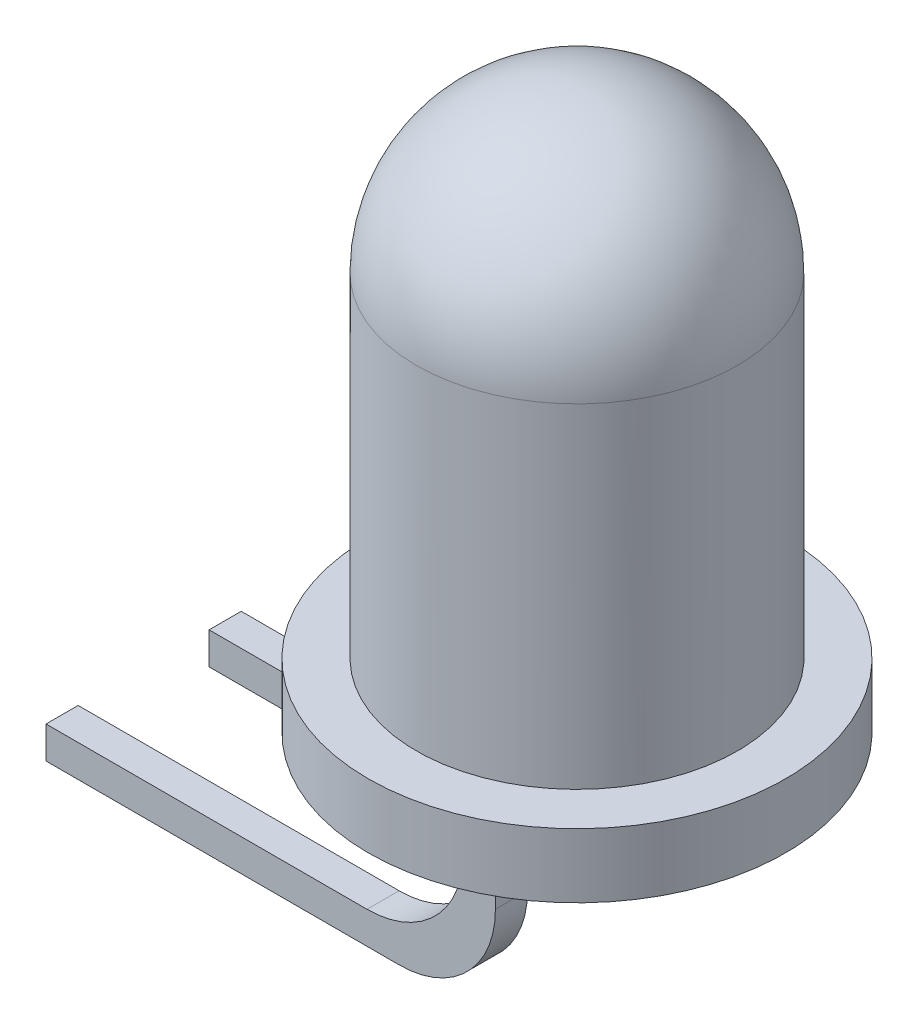
ISO-10303-21;
HEADER;
FILE_DESCRIPTION(('STEP AP214'),'2;1');
FILE_NAME('part.step','',(''),(''),'','','');
FILE_SCHEMA(('AUTOMOTIVE_DESIGN { 1 0 10303 214 1 1 1 1 }'));
ENDSEC;
DATA;
#1=APPLICATION_CONTEXT('core data for automotive mechanical design processes');
#2=APPLICATION_PROTOCOL_DEFINITION('international standard','automotive_design',2000,#1);
#3=PRODUCT_CONTEXT('',#1,'mechanical');
#4=PRODUCT('Part','Part','',(#3));
#5=PRODUCT_RELATED_PRODUCT_CATEGORY('part','',(#4));
#6=PRODUCT_DEFINITION_FORMATION('','',#4);
#7=PRODUCT_DEFINITION_CONTEXT('part definition',#1,'design');
#8=PRODUCT_DEFINITION('design','',#6,#7);
#9=PRODUCT_DEFINITION_SHAPE('','',#8);
#10=(LENGTH_UNIT() NAMED_UNIT(*) SI_UNIT(.MILLI.,.METRE.));
#11=(NAMED_UNIT(*) PLANE_ANGLE_UNIT() SI_UNIT($,.RADIAN.));
#12=(NAMED_UNIT(*) SI_UNIT($,.STERADIAN.) SOLID_ANGLE_UNIT());
#13=UNCERTAINTY_MEASURE_WITH_UNIT(LENGTH_MEASURE(1.E-05),#10,'distance_accuracy_value','');
#14=(GEOMETRIC_REPRESENTATION_CONTEXT(3) GLOBAL_UNCERTAINTY_ASSIGNED_CONTEXT((#13)) GLOBAL_UNIT_ASSIGNED_CONTEXT((#10,
#11,#12)) REPRESENTATION_CONTEXT('',''));
#15=CARTESIAN_POINT('',(0.,0.,0.));
#16=DIRECTION('',(0.,0.,1.));
#17=DIRECTION('',(1.,0.,0.));
#18=AXIS2_PLACEMENT_3D('',#15,#16,#17);
#19=CARTESIAN_POINT('',(-0.25,0.,1.52));
#20=DIRECTION('',(1.,0.,0.));
#21=DIRECTION('',(0.,1.,0.));
#22=AXIS2_PLACEMENT_3D('',#19,#20,#21);
#23=PLANE('',#22);
#24=DIRECTION('',(0.,0.,-1.));
#25=VECTOR('',#24,1.);
#26=CARTESIAN_POINT('',(-0.25,-0.999999999999989,1.52));
#27=LINE('',#26,#25);
#28=CARTESIAN_POINT('',(-0.25,-0.999999999999989,-1.02));
#29=VERTEX_POINT('',#28);
#30=CARTESIAN_POINT('',(-0.25,-0.999999999999989,-1.52));
#31=VERTEX_POINT('',#30);
#32=EDGE_CURVE('E198',#29,#31,#27,.T.);
#33=ORIENTED_EDGE('',*,*,#32,.F.);
#34=DIRECTION('',(0.,1.,0.));
#35=VECTOR('',#34,1.);
#36=CARTESIAN_POINT('',(-0.25,0.,-1.02));
#37=LINE('',#36,#35);
#38=CARTESIAN_POINT('',(-0.25,0.,-1.02));
#39=VERTEX_POINT('',#38);
#40=EDGE_CURVE('E285',#29,#39,#37,.T.);
#41=ORIENTED_EDGE('',*,*,#40,.T.);
#42=DIRECTION('',(0.,0.,-1.));
#43=VECTOR('',#42,1.);
#44=CARTESIAN_POINT('',(-0.25,0.,1.52));
#45=LINE('',#44,#43);
#46=CARTESIAN_POINT('',(-0.25,0.,-1.52));
#47=VERTEX_POINT('',#46);
#48=EDGE_CURVE('E151',#39,#47,#45,.T.);
#49=ORIENTED_EDGE('',*,*,#48,.T.);
#50=DIRECTION('',(0.,-1.,0.));
#51=VECTOR('',#50,1.);
#52=CARTESIAN_POINT('',(-0.25,0.,-1.52));
#53=LINE('',#52,#51);
#54=EDGE_CURVE('E300',#47,#31,#53,.T.);
#55=ORIENTED_EDGE('',*,*,#54,.T.);
#56=EDGE_LOOP('',(#33,#41,#49,#55));
#57=FACE_BOUND('',#56,.T.);
#58=ADVANCED_FACE('F36',(#57),#23,.F.);
#59=CARTESIAN_POINT('',(-1.75,-1.,1.52));
#60=DIRECTION('',(0.,0.,-1.));
#61=DIRECTION('',(-1.,0.,0.));
#62=AXIS2_PLACEMENT_3D('',#59,#60,#61);
#63=CYLINDRICAL_SURFACE('',#62,1.5);
#64=DIRECTION('',(0.,0.,-1.));
#65=VECTOR('',#64,1.);
#66=CARTESIAN_POINT('',(-1.75000000000001,-2.5,1.52));
#67=LINE('',#66,#65);
#68=CARTESIAN_POINT('',(-1.75000000000001,-2.5,-1.02));
#69=VERTEX_POINT('',#68);
#70=CARTESIAN_POINT('',(-1.75000000000001,-2.5,-1.52));
#71=VERTEX_POINT('',#70);
#72=EDGE_CURVE('E194',#69,#71,#67,.T.);
#73=ORIENTED_EDGE('',*,*,#72,.F.);
#74=CARTESIAN_POINT('',(-1.75,-1.,-1.02));
#75=DIRECTION('',(0.,0.,-1.));
#76=DIRECTION('',(-1.,0.,0.));
#77=AXIS2_PLACEMENT_3D('',#74,#75,#76);
#78=CIRCLE('',#77,1.5);
#79=EDGE_CURVE('E282',#69,#29,#78,.F.);
#80=ORIENTED_EDGE('',*,*,#79,.T.);
#81=ORIENTED_EDGE('',*,*,#32,.T.);
#82=CARTESIAN_POINT('',(-1.75,-1.,-1.52));
#83=DIRECTION('',(0.,0.,-1.));
#84=DIRECTION('',(-1.,0.,0.));
#85=AXIS2_PLACEMENT_3D('',#82,#83,#84);
#86=CIRCLE('',#85,1.5);
#87=EDGE_CURVE('E303',#31,#71,#86,.T.);
#88=ORIENTED_EDGE('',*,*,#87,.T.);
#89=EDGE_LOOP('',(#73,#80,#81,#88));
#90=FACE_BOUND('',#89,.T.);
#91=ADVANCED_FACE('F227',(#90),#63,.F.);
#92=CARTESIAN_POINT('',(-1.75000000000001,-2.5,1.52));
#93=DIRECTION('',(0.,-1.,0.));
#94=DIRECTION('',(1.,0.,0.));
#95=AXIS2_PLACEMENT_3D('',#92,#93,#94);
#96=PLANE('',#95);
#97=DIRECTION('',(0.,0.,-1.));
#98=VECTOR('',#97,1.);
#99=CARTESIAN_POINT('',(-6.75,-2.5,1.52));
#100=LINE('',#99,#98);
#101=CARTESIAN_POINT('',(-6.75,-2.5,-1.02));
#102=VERTEX_POINT('',#101);
#103=CARTESIAN_POINT('',(-6.75,-2.5,-1.52));
#104=VERTEX_POINT('',#103);
#105=EDGE_CURVE('E190',#102,#104,#100,.T.);
#106=ORIENTED_EDGE('',*,*,#105,.F.);
#107=DIRECTION('',(1.,0.,0.));
#108=VECTOR('',#107,1.);
#109=CARTESIAN_POINT('',(-1.75000000000001,-2.5,-1.02));
#110=LINE('',#109,#108);
#111=EDGE_CURVE('E279',#102,#69,#110,.T.);
#112=ORIENTED_EDGE('',*,*,#111,.T.);
#113=ORIENTED_EDGE('',*,*,#72,.T.);
#114=DIRECTION('',(-1.,0.,0.));
#115=VECTOR('',#114,1.);
#116=CARTESIAN_POINT('',(-1.75000000000001,-2.5,-1.52));
#117=LINE('',#116,#115);
#118=EDGE_CURVE('E306',#71,#104,#117,.T.);
#119=ORIENTED_EDGE('',*,*,#118,.T.);
#120=EDGE_LOOP('',(#106,#112,#113,#119));
#121=FACE_BOUND('',#120,.T.);
#122=ADVANCED_FACE('F234',(#121),#96,.F.);
#123=CARTESIAN_POINT('',(-6.75,-2.5,1.52));
#124=DIRECTION('',(1.,0.,0.));
#125=DIRECTION('',(0.,0.,-1.));
#126=AXIS2_PLACEMENT_3D('',#123,#124,#125);
#127=PLANE('',#126);
#128=DIRECTION('',(0.,0.,-1.));
#129=VECTOR('',#128,1.);
#130=CARTESIAN_POINT('',(-6.75,-3.,1.52));
#131=LINE('',#130,#129);
#132=CARTESIAN_POINT('',(-6.75,-3.,-1.02));
#133=VERTEX_POINT('',#132);
#134=CARTESIAN_POINT('',(-6.75,-3.,-1.52));
#135=VERTEX_POINT('',#134);
#136=EDGE_CURVE('E186',#133,#135,#131,.T.);
#137=ORIENTED_EDGE('',*,*,#136,.F.);
#138=DIRECTION('',(0.,-1.,0.));
#139=VECTOR('',#138,1.);
#140=CARTESIAN_POINT('',(-6.75,7.29120017555409,-1.02));
#141=LINE('',#140,#139);
#142=EDGE_CURVE('E262',#102,#133,#141,.T.);
#143=ORIENTED_EDGE('',*,*,#142,.F.);
#144=ORIENTED_EDGE('',*,*,#105,.T.);
#145=DIRECTION('',(0.,-1.,0.));
#146=VECTOR('',#145,1.);
#147=CARTESIAN_POINT('',(-6.75,-2.5,-1.52));
#148=LINE('',#147,#146);
#149=EDGE_CURVE('E309',#104,#135,#148,.T.);
#150=ORIENTED_EDGE('',*,*,#149,.T.);
#151=EDGE_LOOP('',(#137,#143,#144,#150));
#152=FACE_BOUND('',#151,.T.);
#153=ADVANCED_FACE('F334',(#152),#127,.F.);
#154=CARTESIAN_POINT('',(-1.25000000000001,-3.,1.52));
#155=DIRECTION('',(0.,1.,0.));
#156=DIRECTION('',(-1.,0.,0.));
#157=AXIS2_PLACEMENT_3D('',#154,#155,#156);
#158=PLANE('',#157);
#159=DIRECTION('',(0.,0.,-1.));
#160=VECTOR('',#159,1.);
#161=CARTESIAN_POINT('',(-1.25000000000001,-3.,1.52));
#162=LINE('',#161,#160);
#163=CARTESIAN_POINT('',(-1.25,-3.,-1.02));
#164=VERTEX_POINT('',#163);
#165=CARTESIAN_POINT('',(-1.25000000000001,-3.,-1.52));
#166=VERTEX_POINT('',#165);
#167=EDGE_CURVE('E182',#164,#166,#162,.T.);
#168=ORIENTED_EDGE('',*,*,#167,.F.);
#169=DIRECTION('',(1.,0.,0.));
#170=VECTOR('',#169,1.);
#171=CARTESIAN_POINT('',(0.,-3.,-1.02));
#172=LINE('',#171,#170);
#173=EDGE_CURVE('E337',#133,#164,#172,.T.);
#174=ORIENTED_EDGE('',*,*,#173,.F.);
#175=ORIENTED_EDGE('',*,*,#136,.T.);
#176=DIRECTION('',(1.,0.,0.));
#177=VECTOR('',#176,1.);
#178=CARTESIAN_POINT('',(-1.25000000000001,-3.,-1.52));
#179=LINE('',#178,#177);
#180=EDGE_CURVE('E312',#135,#166,#179,.T.);
#181=ORIENTED_EDGE('',*,*,#180,.T.);
#182=EDGE_LOOP('',(#168,#174,#175,#181));
#183=FACE_BOUND('',#182,.T.);
#184=ADVANCED_FACE('F336',(#183),#158,.F.);
#185=CARTESIAN_POINT('',(-1.25,-1.5,1.52));
#186=DIRECTION('',(0.,0.,-1.));
#187=DIRECTION('',(-1.,0.,0.));
#188=AXIS2_PLACEMENT_3D('',#185,#186,#187);
#189=CYLINDRICAL_SURFACE('',#188,1.5);
#190=DIRECTION('',(0.,0.,-1.));
#191=VECTOR('',#190,1.);
#192=CARTESIAN_POINT('',(0.25,-1.49999999999999,1.52));
#193=LINE('',#192,#191);
#194=CARTESIAN_POINT('',(0.25,-1.49999999999999,-1.02));
#195=VERTEX_POINT('',#194);
#196=CARTESIAN_POINT('',(0.25,-1.49999999999999,-1.52));
#197=VERTEX_POINT('',#196);
#198=EDGE_CURVE('E173',#195,#197,#193,.T.);
#199=ORIENTED_EDGE('',*,*,#198,.F.);
#200=CARTESIAN_POINT('',(-1.25,-1.5,-1.02));
#201=DIRECTION('',(0.,0.,-1.));
#202=DIRECTION('',(-1.,0.,0.));
#203=AXIS2_PLACEMENT_3D('',#200,#201,#202);
#204=CIRCLE('',#203,1.5);
#205=EDGE_CURVE('E160',#195,#164,#204,.T.);
#206=ORIENTED_EDGE('',*,*,#205,.T.);
#207=ORIENTED_EDGE('',*,*,#167,.T.);
#208=CARTESIAN_POINT('',(-1.25,-1.5,-1.52));
#209=DIRECTION('',(0.,0.,1.));
#210=DIRECTION('',(-1.,0.,0.));
#211=AXIS2_PLACEMENT_3D('',#208,#209,#210);
#212=CIRCLE('',#211,1.5);
#213=EDGE_CURVE('E314',#166,#197,#212,.T.);
#214=ORIENTED_EDGE('',*,*,#213,.T.);
#215=EDGE_LOOP('',(#199,#206,#207,#214));
#216=FACE_BOUND('',#215,.T.);
#217=ADVANCED_FACE('F318',(#216),#189,.T.);
#218=CARTESIAN_POINT('',(0.25,0.,1.52));
#219=DIRECTION('',(-1.,0.,0.));
#220=DIRECTION('',(0.,-1.,0.));
#221=AXIS2_PLACEMENT_3D('',#218,#219,#220);
#222=PLANE('',#221);
#223=DIRECTION('',(0.,0.,-1.));
#224=VECTOR('',#223,1.);
#225=CARTESIAN_POINT('',(0.25,0.,1.52));
#226=LINE('',#225,#224);
#227=CARTESIAN_POINT('',(0.25,0.,-1.02));
#228=VERTEX_POINT('',#227);
#229=CARTESIAN_POINT('',(0.25,0.,-1.52));
#230=VERTEX_POINT('',#229);
#231=EDGE_CURVE('E59',#228,#230,#226,.T.);
#232=ORIENTED_EDGE('',*,*,#231,.F.);
#233=DIRECTION('',(0.,-1.,0.));
#234=VECTOR('',#233,1.);
#235=CARTESIAN_POINT('',(0.25,7.29120017555409,-1.02));
#236=LINE('',#235,#234);
#237=EDGE_CURVE('E154',#228,#195,#236,.T.);
#238=ORIENTED_EDGE('',*,*,#237,.T.);
#239=ORIENTED_EDGE('',*,*,#198,.T.);
#240=DIRECTION('',(0.,1.,0.));
#241=VECTOR('',#240,1.);
#242=CARTESIAN_POINT('',(0.25,0.,-1.52));
#243=LINE('',#242,#241);
#244=EDGE_CURVE('E168',#197,#230,#243,.T.);
#245=ORIENTED_EDGE('',*,*,#244,.T.);
#246=EDGE_LOOP('',(#232,#238,#239,#245));
#247=FACE_BOUND('',#246,.T.);
#248=ADVANCED_FACE('F166',(#247),#222,.F.);
#249=CARTESIAN_POINT('',(0.,6.2,0.));
#250=DIRECTION('',(0.,-1.,0.));
#251=DIRECTION('',(0.,0.,1.));
#252=AXIS2_PLACEMENT_3D('',#249,#250,#251);
#253=SPHERICAL_SURFACE('',#252,2.5);
#254=CARTESIAN_POINT('',(0.,6.2,0.));
#255=DIRECTION('',(0.,-1.,0.));
#256=DIRECTION('',(0.,0.,-1.));
#257=AXIS2_PLACEMENT_3D('',#254,#255,#256);
#258=CIRCLE('',#257,2.5);
#259=CARTESIAN_POINT('',(0.,6.2,-2.5));
#260=VERTEX_POINT('',#259);
#261=EDGE_CURVE('E11',#260,#260,#258,.T.);
#262=ORIENTED_EDGE('',*,*,#261,.F.);
#263=EDGE_LOOP('',(#262));
#264=FACE_BOUND('',#263,.T.);
#265=ADVANCED_FACE('F38',(#264),#253,.T.);
#266=CARTESIAN_POINT('',(0.,-2.60330162387972,0.));
#267=DIRECTION('',(0.,-1.,0.));
#268=DIRECTION('',(0.,0.,-1.));
#269=AXIS2_PLACEMENT_3D('',#266,#267,#268);
#270=CYLINDRICAL_SURFACE('',#269,2.5);
#271=ORIENTED_EDGE('',*,*,#261,.T.);
#272=EDGE_LOOP('',(#271));
#273=FACE_BOUND('',#272,.T.);
#274=CARTESIAN_POINT('',(0.,1.,0.));
#275=DIRECTION('',(0.,-1.,0.));
#276=DIRECTION('',(0.,0.,-1.));
#277=AXIS2_PLACEMENT_3D('',#274,#275,#276);
#278=CIRCLE('',#277,2.5);
#279=CARTESIAN_POINT('',(0.,1.,-2.5));
#280=VERTEX_POINT('',#279);
#281=EDGE_CURVE('E44',#280,#280,#278,.T.);
#282=ORIENTED_EDGE('',*,*,#281,.F.);
#283=EDGE_LOOP('',(#282));
#284=FACE_BOUND('',#283,.T.);
#285=ADVANCED_FACE('F216',(#273,#284),#270,.T.);
#286=CARTESIAN_POINT('',(0.,1.,0.));
#287=DIRECTION('',(0.,1.,0.));
#288=DIRECTION('',(0.,0.,1.));
#289=AXIS2_PLACEMENT_3D('',#286,#287,#288);
#290=PLANE('',#289);
#291=ORIENTED_EDGE('',*,*,#281,.T.);
#292=EDGE_LOOP('',(#291));
#293=FACE_BOUND('',#292,.T.);
#294=CARTESIAN_POINT('',(0.,1.,0.));
#295=DIRECTION('',(0.,-1.,0.));
#296=DIRECTION('',(0.,0.,-1.));
#297=AXIS2_PLACEMENT_3D('',#294,#295,#296);
#298=CIRCLE('',#297,3.25);
#299=CARTESIAN_POINT('',(0.,1.,-3.25));
#300=VERTEX_POINT('',#299);
#301=EDGE_CURVE('E208',#300,#300,#298,.T.);
#302=ORIENTED_EDGE('',*,*,#301,.F.);
#303=EDGE_LOOP('',(#302));
#304=FACE_BOUND('',#303,.T.);
#305=ADVANCED_FACE('F213',(#293,#304),#290,.T.);
#306=CARTESIAN_POINT('',(0.,-2.60330162387972,0.));
#307=DIRECTION('',(0.,-1.,0.));
#308=DIRECTION('',(0.,0.,-1.));
#309=AXIS2_PLACEMENT_3D('',#306,#307,#308);
#310=CYLINDRICAL_SURFACE('',#309,3.25);
#311=ORIENTED_EDGE('',*,*,#301,.T.);
#312=EDGE_LOOP('',(#311));
#313=FACE_BOUND('',#312,.T.);
#314=CARTESIAN_POINT('',(0.,0.,0.));
#315=DIRECTION('',(0.,-1.,0.));
#316=DIRECTION('',(0.,0.,-1.));
#317=AXIS2_PLACEMENT_3D('',#314,#315,#316);
#318=CIRCLE('',#317,3.25);
#319=CARTESIAN_POINT('',(0.,0.,-3.25));
#320=VERTEX_POINT('',#319);
#321=EDGE_CURVE('E205',#320,#320,#318,.T.);
#322=ORIENTED_EDGE('',*,*,#321,.F.);
#323=EDGE_LOOP('',(#322));
#324=FACE_BOUND('',#323,.T.);
#325=ADVANCED_FACE('F223',(#313,#324),#310,.T.);
#326=CARTESIAN_POINT('',(0.,0.,0.));
#327=DIRECTION('',(0.,1.,0.));
#328=DIRECTION('',(0.,0.,1.));
#329=AXIS2_PLACEMENT_3D('',#326,#327,#328);
#330=PLANE('',#329);
#331=ORIENTED_EDGE('',*,*,#321,.T.);
#332=EDGE_LOOP('',(#331));
#333=FACE_BOUND('',#332,.T.);
#334=DIRECTION('',(-1.,0.,0.));
#335=VECTOR('',#334,1.);
#336=CARTESIAN_POINT('',(0.,0.,1.02));
#337=LINE('',#336,#335);
#338=CARTESIAN_POINT('',(0.25,0.,1.02));
#339=VERTEX_POINT('',#338);
#340=CARTESIAN_POINT('',(-0.25,0.,1.02));
#341=VERTEX_POINT('',#340);
#342=EDGE_CURVE('E51',#339,#341,#337,.T.);
#343=ORIENTED_EDGE('',*,*,#342,.T.);
#344=CARTESIAN_POINT('',(-0.25,0.,1.52));
#345=VERTEX_POINT('',#344);
#346=EDGE_CURVE('E202',#345,#341,#45,.T.);
#347=ORIENTED_EDGE('',*,*,#346,.F.);
#348=DIRECTION('',(-1.,0.,0.));
#349=VECTOR('',#348,1.);
#350=CARTESIAN_POINT('',(-0.25,0.,1.52));
#351=LINE('',#350,#349);
#352=CARTESIAN_POINT('',(0.25,0.,1.52));
#353=VERTEX_POINT('',#352);
#354=EDGE_CURVE('E257',#353,#345,#351,.T.);
#355=ORIENTED_EDGE('',*,*,#354,.F.);
#356=EDGE_CURVE('E169',#353,#339,#226,.T.);
#357=ORIENTED_EDGE('',*,*,#356,.T.);
#358=EDGE_LOOP('',(#343,#347,#355,#357));
#359=FACE_BOUND('',#358,.T.);
#360=ORIENTED_EDGE('',*,*,#48,.F.);
#361=DIRECTION('',(1.,0.,0.));
#362=VECTOR('',#361,1.);
#363=CARTESIAN_POINT('',(0.,0.,-1.02));
#364=LINE('',#363,#362);
#365=EDGE_CURVE('E148',#39,#228,#364,.T.);
#366=ORIENTED_EDGE('',*,*,#365,.T.);
#367=ORIENTED_EDGE('',*,*,#231,.T.);
#368=DIRECTION('',(-1.,0.,0.));
#369=VECTOR('',#368,1.);
#370=CARTESIAN_POINT('',(-0.25,0.,-1.52));
#371=LINE('',#370,#369);
#372=EDGE_CURVE('E287',#230,#47,#371,.T.);
#373=ORIENTED_EDGE('',*,*,#372,.T.);
#374=EDGE_LOOP('',(#360,#366,#367,#373));
#375=FACE_BOUND('',#374,.T.);
#376=ADVANCED_FACE('F150',(#333,#359,#375),#330,.F.);
#377=ORIENTED_EDGE('',*,*,#346,.T.);
#378=DIRECTION('',(0.,-1.,0.));
#379=VECTOR('',#378,1.);
#380=CARTESIAN_POINT('',(-0.25,0.,1.02));
#381=LINE('',#380,#379);
#382=CARTESIAN_POINT('',(-0.25,-1.,1.02));
#383=VERTEX_POINT('',#382);
#384=EDGE_CURVE('E252',#341,#383,#381,.T.);
#385=ORIENTED_EDGE('',*,*,#384,.T.);
#386=CARTESIAN_POINT('',(-0.25,-0.999999999999989,1.52));
#387=VERTEX_POINT('',#386);
#388=EDGE_CURVE('E199',#387,#383,#27,.T.);
#389=ORIENTED_EDGE('',*,*,#388,.F.);
#390=DIRECTION('',(0.,-1.,0.));
#391=VECTOR('',#390,1.);
#392=CARTESIAN_POINT('',(-0.25,0.,1.52));
#393=LINE('',#392,#391);
#394=EDGE_CURVE('E253',#345,#387,#393,.T.);
#395=ORIENTED_EDGE('',*,*,#394,.F.);
#396=EDGE_LOOP('',(#377,#385,#389,#395));
#397=FACE_BOUND('',#396,.T.);
#398=ADVANCED_FACE('F230',(#397),#23,.F.);
#399=ORIENTED_EDGE('',*,*,#388,.T.);
#400=CARTESIAN_POINT('',(-1.75,-1.,1.02));
#401=DIRECTION('',(0.,0.,1.));
#402=DIRECTION('',(1.,0.,0.));
#403=AXIS2_PLACEMENT_3D('',#400,#401,#402);
#404=CIRCLE('',#403,1.5);
#405=CARTESIAN_POINT('',(-1.75000000000001,-2.5,1.02));
#406=VERTEX_POINT('',#405);
#407=EDGE_CURVE('E274',#383,#406,#404,.F.);
#408=ORIENTED_EDGE('',*,*,#407,.T.);
#409=CARTESIAN_POINT('',(-1.75000000000001,-2.5,1.52));
#410=VERTEX_POINT('',#409);
#411=EDGE_CURVE('E195',#410,#406,#67,.T.);
#412=ORIENTED_EDGE('',*,*,#411,.F.);
#413=CARTESIAN_POINT('',(-1.75,-1.,1.52));
#414=DIRECTION('',(0.,0.,-1.));
#415=DIRECTION('',(-1.,0.,0.));
#416=AXIS2_PLACEMENT_3D('',#413,#414,#415);
#417=CIRCLE('',#416,1.5);
#418=EDGE_CURVE('E290',#387,#410,#417,.T.);
#419=ORIENTED_EDGE('',*,*,#418,.F.);
#420=EDGE_LOOP('',(#399,#408,#412,#419));
#421=FACE_BOUND('',#420,.T.);
#422=ADVANCED_FACE('F237',(#421),#63,.F.);
#423=ORIENTED_EDGE('',*,*,#411,.T.);
#424=DIRECTION('',(-1.,0.,0.));
#425=VECTOR('',#424,1.);
#426=CARTESIAN_POINT('',(-1.75000000000001,-2.5,1.02));
#427=LINE('',#426,#425);
#428=CARTESIAN_POINT('',(-6.75,-2.5,1.02));
#429=VERTEX_POINT('',#428);
#430=EDGE_CURVE('E271',#406,#429,#427,.T.);
#431=ORIENTED_EDGE('',*,*,#430,.T.);
#432=CARTESIAN_POINT('',(-6.75,-2.5,1.52));
#433=VERTEX_POINT('',#432);
#434=EDGE_CURVE('E191',#433,#429,#100,.T.);
#435=ORIENTED_EDGE('',*,*,#434,.F.);
#436=DIRECTION('',(-1.,0.,0.));
#437=VECTOR('',#436,1.);
#438=CARTESIAN_POINT('',(-1.75000000000001,-2.5,1.52));
#439=LINE('',#438,#437);
#440=EDGE_CURVE('E292',#410,#433,#439,.T.);
#441=ORIENTED_EDGE('',*,*,#440,.F.);
#442=EDGE_LOOP('',(#423,#431,#435,#441));
#443=FACE_BOUND('',#442,.T.);
#444=ADVANCED_FACE('F246',(#443),#96,.F.);
#445=ORIENTED_EDGE('',*,*,#434,.T.);
#446=DIRECTION('',(0.,-1.,0.));
#447=VECTOR('',#446,1.);
#448=CARTESIAN_POINT('',(-6.75,7.29120017555409,1.02));
#449=LINE('',#448,#447);
#450=CARTESIAN_POINT('',(-6.75,-3.,1.02));
#451=VERTEX_POINT('',#450);
#452=EDGE_CURVE('E259',#429,#451,#449,.T.);
#453=ORIENTED_EDGE('',*,*,#452,.T.);
#454=CARTESIAN_POINT('',(-6.75,-3.,1.52));
#455=VERTEX_POINT('',#454);
#456=EDGE_CURVE('E187',#455,#451,#131,.T.);
#457=ORIENTED_EDGE('',*,*,#456,.F.);
#458=DIRECTION('',(0.,-1.,0.));
#459=VECTOR('',#458,1.);
#460=CARTESIAN_POINT('',(-6.75,-2.5,1.52));
#461=LINE('',#460,#459);
#462=EDGE_CURVE('E294',#433,#455,#461,.T.);
#463=ORIENTED_EDGE('',*,*,#462,.F.);
#464=EDGE_LOOP('',(#445,#453,#457,#463));
#465=FACE_BOUND('',#464,.T.);
#466=ADVANCED_FACE('F345',(#465),#127,.F.);
#467=ORIENTED_EDGE('',*,*,#456,.T.);
#468=DIRECTION('',(-1.,0.,0.));
#469=VECTOR('',#468,1.);
#470=CARTESIAN_POINT('',(0.,-3.,1.02));
#471=LINE('',#470,#469);
#472=CARTESIAN_POINT('',(-1.25,-3.,1.02));
#473=VERTEX_POINT('',#472);
#474=EDGE_CURVE('E155',#473,#451,#471,.T.);
#475=ORIENTED_EDGE('',*,*,#474,.F.);
#476=CARTESIAN_POINT('',(-1.25000000000001,-3.,1.52));
#477=VERTEX_POINT('',#476);
#478=EDGE_CURVE('E183',#477,#473,#162,.T.);
#479=ORIENTED_EDGE('',*,*,#478,.F.);
#480=DIRECTION('',(1.,0.,0.));
#481=VECTOR('',#480,1.);
#482=CARTESIAN_POINT('',(-1.25000000000001,-3.,1.52));
#483=LINE('',#482,#481);
#484=EDGE_CURVE('E296',#455,#477,#483,.T.);
#485=ORIENTED_EDGE('',*,*,#484,.F.);
#486=EDGE_LOOP('',(#467,#475,#479,#485));
#487=FACE_BOUND('',#486,.T.);
#488=ADVANCED_FACE('F349',(#487),#158,.F.);
#489=ORIENTED_EDGE('',*,*,#478,.T.);
#490=CARTESIAN_POINT('',(-1.25,-1.5,1.02));
#491=DIRECTION('',(0.,0.,1.));
#492=DIRECTION('',(1.,0.,0.));
#493=AXIS2_PLACEMENT_3D('',#490,#491,#492);
#494=CIRCLE('',#493,1.5);
#495=CARTESIAN_POINT('',(0.25,-1.49999999999999,1.02));
#496=VERTEX_POINT('',#495);
#497=EDGE_CURVE('E268',#473,#496,#494,.T.);
#498=ORIENTED_EDGE('',*,*,#497,.T.);
#499=CARTESIAN_POINT('',(0.25,-1.49999999999999,1.52));
#500=VERTEX_POINT('',#499);
#501=EDGE_CURVE('E179',#500,#496,#193,.T.);
#502=ORIENTED_EDGE('',*,*,#501,.F.);
#503=CARTESIAN_POINT('',(-1.25,-1.5,1.52));
#504=DIRECTION('',(0.,0.,1.));
#505=DIRECTION('',(-1.,0.,0.));
#506=AXIS2_PLACEMENT_3D('',#503,#504,#505);
#507=CIRCLE('',#506,1.5);
#508=EDGE_CURVE('E174',#477,#500,#507,.T.);
#509=ORIENTED_EDGE('',*,*,#508,.F.);
#510=EDGE_LOOP('',(#489,#498,#502,#509));
#511=FACE_BOUND('',#510,.T.);
#512=ADVANCED_FACE('F374',(#511),#189,.T.);
#513=ORIENTED_EDGE('',*,*,#501,.T.);
#514=DIRECTION('',(0.,-1.,0.));
#515=VECTOR('',#514,1.);
#516=CARTESIAN_POINT('',(0.25,7.29120017555409,1.02));
#517=LINE('',#516,#515);
#518=EDGE_CURVE('E163',#339,#496,#517,.T.);
#519=ORIENTED_EDGE('',*,*,#518,.F.);
#520=ORIENTED_EDGE('',*,*,#356,.F.);
#521=DIRECTION('',(0.,1.,0.));
#522=VECTOR('',#521,1.);
#523=CARTESIAN_POINT('',(0.25,0.,1.52));
#524=LINE('',#523,#522);
#525=EDGE_CURVE('E170',#500,#353,#524,.T.);
#526=ORIENTED_EDGE('',*,*,#525,.F.);
#527=EDGE_LOOP('',(#513,#519,#520,#526));
#528=FACE_BOUND('',#527,.T.);
#529=ADVANCED_FACE('F377',(#528),#222,.F.);
#530=CARTESIAN_POINT('',(-1.25,-1.5,1.52));
#531=DIRECTION('',(0.,0.,-1.));
#532=DIRECTION('',(-1.,0.,0.));
#533=AXIS2_PLACEMENT_3D('',#530,#531,#532);
#534=PLANE('',#533);
#535=ORIENTED_EDGE('',*,*,#354,.T.);
#536=ORIENTED_EDGE('',*,*,#394,.T.);
#537=ORIENTED_EDGE('',*,*,#418,.T.);
#538=ORIENTED_EDGE('',*,*,#440,.T.);
#539=ORIENTED_EDGE('',*,*,#462,.T.);
#540=ORIENTED_EDGE('',*,*,#484,.T.);
#541=ORIENTED_EDGE('',*,*,#508,.T.);
#542=ORIENTED_EDGE('',*,*,#525,.T.);
#543=EDGE_LOOP('',(#535,#536,#537,#538,#539,#540,#541,#542));
#544=FACE_BOUND('',#543,.T.);
#545=ADVANCED_FACE('F352',(#544),#534,.F.);
#546=CARTESIAN_POINT('',(-1.25,-1.5,-1.52));
#547=DIRECTION('',(0.,0.,-1.));
#548=DIRECTION('',(-1.,0.,0.));
#549=AXIS2_PLACEMENT_3D('',#546,#547,#548);
#550=PLANE('',#549);
#551=ORIENTED_EDGE('',*,*,#372,.F.);
#552=ORIENTED_EDGE('',*,*,#244,.F.);
#553=ORIENTED_EDGE('',*,*,#213,.F.);
#554=ORIENTED_EDGE('',*,*,#180,.F.);
#555=ORIENTED_EDGE('',*,*,#149,.F.);
#556=ORIENTED_EDGE('',*,*,#118,.F.);
#557=ORIENTED_EDGE('',*,*,#87,.F.);
#558=ORIENTED_EDGE('',*,*,#54,.F.);
#559=EDGE_LOOP('',(#551,#552,#553,#554,#555,#556,#557,#558));
#560=FACE_BOUND('',#559,.T.);
#561=ADVANCED_FACE('F322',(#560),#550,.T.);
#562=CARTESIAN_POINT('',(0.,7.29120017555409,-1.02));
#563=DIRECTION('',(0.,0.,-1.));
#564=DIRECTION('',(-1.,0.,0.));
#565=AXIS2_PLACEMENT_3D('',#562,#563,#564);
#566=PLANE('',#565);
#567=ORIENTED_EDGE('',*,*,#79,.F.);
#568=ORIENTED_EDGE('',*,*,#111,.F.);
#569=ORIENTED_EDGE('',*,*,#142,.T.);
#570=ORIENTED_EDGE('',*,*,#173,.T.);
#571=ORIENTED_EDGE('',*,*,#205,.F.);
#572=ORIENTED_EDGE('',*,*,#237,.F.);
#573=ORIENTED_EDGE('',*,*,#365,.F.);
#574=ORIENTED_EDGE('',*,*,#40,.F.);
#575=EDGE_LOOP('',(#567,#568,#569,#570,#571,#572,#573,#574));
#576=FACE_BOUND('',#575,.T.);
#577=ADVANCED_FACE('F158',(#576),#566,.F.);
#578=CARTESIAN_POINT('',(0.,7.29120017555409,1.02));
#579=DIRECTION('',(0.,0.,1.));
#580=DIRECTION('',(1.,0.,0.));
#581=AXIS2_PLACEMENT_3D('',#578,#579,#580);
#582=PLANE('',#581);
#583=ORIENTED_EDGE('',*,*,#342,.F.);
#584=ORIENTED_EDGE('',*,*,#518,.T.);
#585=ORIENTED_EDGE('',*,*,#497,.F.);
#586=ORIENTED_EDGE('',*,*,#474,.T.);
#587=ORIENTED_EDGE('',*,*,#452,.F.);
#588=ORIENTED_EDGE('',*,*,#430,.F.);
#589=ORIENTED_EDGE('',*,*,#407,.F.);
#590=ORIENTED_EDGE('',*,*,#384,.F.);
#591=EDGE_LOOP('',(#583,#584,#585,#586,#587,#588,#589,#590));
#592=FACE_BOUND('',#591,.T.);
#593=ADVANCED_FACE('F340',(#592),#582,.F.);
#594=CLOSED_SHELL('',(#58,#91,#122,#153,#184,#217,#248,#265,#285,#305,#325,#376,#398,#422,#444,
#466,#488,#512,#529,#545,#561,#577,#593));
#595=MANIFOLD_SOLID_BREP('B2',#594);
#596=ADVANCED_BREP_SHAPE_REPRESENTATION('',(#18,#595),#14);
#597=SHAPE_DEFINITION_REPRESENTATION(#9,#596);
ENDSEC;
END-ISO-10303-21;
